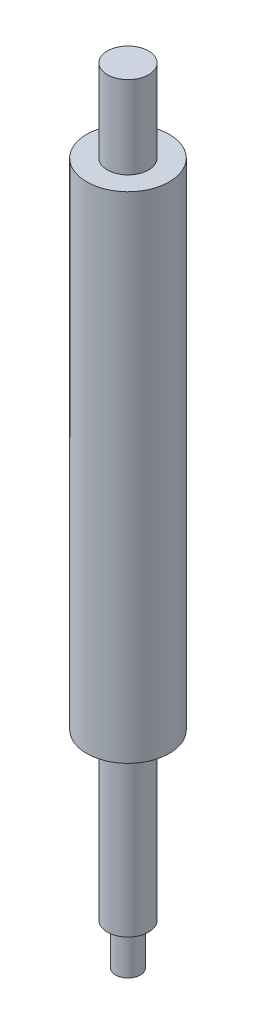
ISO-10303-21;
HEADER;
FILE_DESCRIPTION(('STEP AP214'),'2;1');
FILE_NAME('part.step','',(''),(''),'','','');
FILE_SCHEMA(('AUTOMOTIVE_DESIGN { 1 0 10303 214 1 1 1 1 }'));
ENDSEC;
DATA;
#1=APPLICATION_CONTEXT('core data for automotive mechanical design processes');
#2=APPLICATION_PROTOCOL_DEFINITION('international standard','automotive_design',2000,#1);
#3=PRODUCT_CONTEXT('',#1,'mechanical');
#4=PRODUCT('Part','Part','',(#3));
#5=PRODUCT_RELATED_PRODUCT_CATEGORY('part','',(#4));
#6=PRODUCT_DEFINITION_FORMATION('','',#4);
#7=PRODUCT_DEFINITION_CONTEXT('part definition',#1,'design');
#8=PRODUCT_DEFINITION('design','',#6,#7);
#9=PRODUCT_DEFINITION_SHAPE('','',#8);
#10=(LENGTH_UNIT() NAMED_UNIT(*) SI_UNIT(.MILLI.,.METRE.));
#11=(NAMED_UNIT(*) PLANE_ANGLE_UNIT() SI_UNIT($,.RADIAN.));
#12=(NAMED_UNIT(*) SI_UNIT($,.STERADIAN.) SOLID_ANGLE_UNIT());
#13=UNCERTAINTY_MEASURE_WITH_UNIT(LENGTH_MEASURE(1.E-05),#10,'distance_accuracy_value','');
#14=(GEOMETRIC_REPRESENTATION_CONTEXT(3) GLOBAL_UNCERTAINTY_ASSIGNED_CONTEXT((#13)) GLOBAL_UNIT_ASSIGNED_CONTEXT((#10,
#11,#12)) REPRESENTATION_CONTEXT('',''));
#15=CARTESIAN_POINT('',(0.,0.,0.));
#16=DIRECTION('',(0.,0.,1.));
#17=DIRECTION('',(1.,0.,0.));
#18=AXIS2_PLACEMENT_3D('',#15,#16,#17);
#19=CARTESIAN_POINT('',(1.5,0.,0.));
#20=DIRECTION('',(0.,1.,0.));
#21=DIRECTION('',(-1.,0.,0.));
#22=AXIS2_PLACEMENT_3D('',#19,#20,#21);
#23=PLANE('',#22);
#24=CARTESIAN_POINT('',(0.,0.,0.));
#25=DIRECTION('',(0.,1.,0.));
#26=DIRECTION('',(-1.,0.,0.));
#27=AXIS2_PLACEMENT_3D('',#24,#25,#26);
#28=CIRCLE('',#27,1.5);
#29=CARTESIAN_POINT('',(-1.5,0.,0.));
#30=VERTEX_POINT('',#29);
#31=EDGE_CURVE('E10',#30,#30,#28,.T.);
#32=ORIENTED_EDGE('',*,*,#31,.F.);
#33=EDGE_LOOP('',(#32));
#34=FACE_BOUND('',#33,.T.);
#35=ADVANCED_FACE('F30',(#34),#23,.F.);
#36=CARTESIAN_POINT('',(0.,95.,0.));
#37=DIRECTION('',(0.,1.,0.));
#38=DIRECTION('',(-1.,0.,0.));
#39=AXIS2_PLACEMENT_3D('',#36,#37,#38);
#40=CYLINDRICAL_SURFACE('',#39,1.5);
#41=CARTESIAN_POINT('',(0.,5.,0.));
#42=DIRECTION('',(0.,1.,0.));
#43=DIRECTION('',(-1.,0.,0.));
#44=AXIS2_PLACEMENT_3D('',#41,#42,#43);
#45=CIRCLE('',#44,1.5);
#46=CARTESIAN_POINT('',(-1.5,5.,0.));
#47=VERTEX_POINT('',#46);
#48=EDGE_CURVE('E36',#47,#47,#45,.T.);
#49=ORIENTED_EDGE('',*,*,#48,.F.);
#50=EDGE_LOOP('',(#49));
#51=FACE_BOUND('',#50,.T.);
#52=ORIENTED_EDGE('',*,*,#31,.T.);
#53=EDGE_LOOP('',(#52));
#54=FACE_BOUND('',#53,.T.);
#55=ADVANCED_FACE('F96',(#51,#54),#40,.T.);
#56=CARTESIAN_POINT('',(2.50000000000001,5.,0.));
#57=DIRECTION('',(0.,1.,0.));
#58=DIRECTION('',(-1.,0.,0.));
#59=AXIS2_PLACEMENT_3D('',#56,#57,#58);
#60=PLANE('',#59);
#61=CARTESIAN_POINT('',(0.,5.,0.));
#62=DIRECTION('',(0.,1.,0.));
#63=DIRECTION('',(-1.,0.,0.));
#64=AXIS2_PLACEMENT_3D('',#61,#62,#63);
#65=CIRCLE('',#64,2.50000000000001);
#66=CARTESIAN_POINT('',(-2.50000000000001,5.,0.));
#67=VERTEX_POINT('',#66);
#68=EDGE_CURVE('E40',#67,#67,#65,.T.);
#69=ORIENTED_EDGE('',*,*,#68,.F.);
#70=EDGE_LOOP('',(#69));
#71=FACE_BOUND('',#70,.T.);
#72=ORIENTED_EDGE('',*,*,#48,.T.);
#73=EDGE_LOOP('',(#72));
#74=FACE_BOUND('',#73,.T.);
#75=ADVANCED_FACE('F91',(#71,#74),#60,.F.);
#76=CARTESIAN_POINT('',(0.,95.,0.));
#77=DIRECTION('',(0.,1.,0.));
#78=DIRECTION('',(-1.,0.,0.));
#79=AXIS2_PLACEMENT_3D('',#76,#77,#78);
#80=CYLINDRICAL_SURFACE('',#79,2.50000000000001);
#81=CARTESIAN_POINT('',(0.,25.,0.));
#82=DIRECTION('',(0.,1.,0.));
#83=DIRECTION('',(-1.,0.,0.));
#84=AXIS2_PLACEMENT_3D('',#81,#82,#83);
#85=CIRCLE('',#84,2.50000000000001);
#86=CARTESIAN_POINT('',(-2.50000000000001,25.,0.));
#87=VERTEX_POINT('',#86);
#88=EDGE_CURVE('E44',#87,#87,#85,.T.);
#89=ORIENTED_EDGE('',*,*,#88,.F.);
#90=EDGE_LOOP('',(#89));
#91=FACE_BOUND('',#90,.T.);
#92=ORIENTED_EDGE('',*,*,#68,.T.);
#93=EDGE_LOOP('',(#92));
#94=FACE_BOUND('',#93,.T.);
#95=ADVANCED_FACE('F85',(#91,#94),#80,.T.);
#96=CARTESIAN_POINT('',(2.50000000000001,25.,0.));
#97=DIRECTION('',(0.,1.,0.));
#98=DIRECTION('',(-1.,0.,0.));
#99=AXIS2_PLACEMENT_3D('',#96,#97,#98);
#100=PLANE('',#99);
#101=CARTESIAN_POINT('',(0.,25.,0.));
#102=DIRECTION('',(0.,1.,0.));
#103=DIRECTION('',(-1.,0.,0.));
#104=AXIS2_PLACEMENT_3D('',#101,#102,#103);
#105=CIRCLE('',#104,5.00000000000001);
#106=CARTESIAN_POINT('',(-5.00000000000001,25.,0.));
#107=VERTEX_POINT('',#106);
#108=EDGE_CURVE('E49',#107,#107,#105,.T.);
#109=ORIENTED_EDGE('',*,*,#108,.F.);
#110=EDGE_LOOP('',(#109));
#111=FACE_BOUND('',#110,.T.);
#112=ORIENTED_EDGE('',*,*,#88,.T.);
#113=EDGE_LOOP('',(#112));
#114=FACE_BOUND('',#113,.T.);
#115=ADVANCED_FACE('F79',(#111,#114),#100,.F.);
#116=CARTESIAN_POINT('',(0.,95.,0.));
#117=DIRECTION('',(0.,1.,0.));
#118=DIRECTION('',(-1.,0.,0.));
#119=AXIS2_PLACEMENT_3D('',#116,#117,#118);
#120=CYLINDRICAL_SURFACE('',#119,5.00000000000001);
#121=CARTESIAN_POINT('',(0.,85.,0.));
#122=DIRECTION('',(0.,1.,0.));
#123=DIRECTION('',(-1.,0.,0.));
#124=AXIS2_PLACEMENT_3D('',#121,#122,#123);
#125=CIRCLE('',#124,5.00000000000001);
#126=CARTESIAN_POINT('',(-5.00000000000001,85.,0.));
#127=VERTEX_POINT('',#126);
#128=EDGE_CURVE('E52',#127,#127,#125,.T.);
#129=ORIENTED_EDGE('',*,*,#128,.F.);
#130=EDGE_LOOP('',(#129));
#131=FACE_BOUND('',#130,.T.);
#132=ORIENTED_EDGE('',*,*,#108,.T.);
#133=EDGE_LOOP('',(#132));
#134=FACE_BOUND('',#133,.T.);
#135=ADVANCED_FACE('F73',(#131,#134),#120,.T.);
#136=CARTESIAN_POINT('',(5.00000000000001,85.,0.));
#137=DIRECTION('',(0.,-1.,0.));
#138=DIRECTION('',(1.,0.,0.));
#139=AXIS2_PLACEMENT_3D('',#136,#137,#138);
#140=PLANE('',#139);
#141=CARTESIAN_POINT('',(0.,85.,0.));
#142=DIRECTION('',(0.,1.,0.));
#143=DIRECTION('',(-1.,0.,0.));
#144=AXIS2_PLACEMENT_3D('',#141,#142,#143);
#145=CIRCLE('',#144,2.50000000000001);
#146=CARTESIAN_POINT('',(-2.50000000000002,85.,0.));
#147=VERTEX_POINT('',#146);
#148=EDGE_CURVE('E55',#147,#147,#145,.T.);
#149=ORIENTED_EDGE('',*,*,#148,.F.);
#150=EDGE_LOOP('',(#149));
#151=FACE_BOUND('',#150,.T.);
#152=ORIENTED_EDGE('',*,*,#128,.T.);
#153=EDGE_LOOP('',(#152));
#154=FACE_BOUND('',#153,.T.);
#155=ADVANCED_FACE('F67',(#151,#154),#140,.F.);
#156=CARTESIAN_POINT('',(0.,95.,0.));
#157=DIRECTION('',(0.,1.,0.));
#158=DIRECTION('',(-1.,0.,0.));
#159=AXIS2_PLACEMENT_3D('',#156,#157,#158);
#160=CYLINDRICAL_SURFACE('',#159,2.50000000000001);
#161=CARTESIAN_POINT('',(0.,95.,0.));
#162=DIRECTION('',(0.,1.,0.));
#163=DIRECTION('',(-1.,0.,0.));
#164=AXIS2_PLACEMENT_3D('',#161,#162,#163);
#165=CIRCLE('',#164,2.50000000000001);
#166=CARTESIAN_POINT('',(-2.50000000000001,95.,0.));
#167=VERTEX_POINT('',#166);
#168=EDGE_CURVE('E58',#167,#167,#165,.T.);
#169=ORIENTED_EDGE('',*,*,#168,.F.);
#170=EDGE_LOOP('',(#169));
#171=FACE_BOUND('',#170,.T.);
#172=ORIENTED_EDGE('',*,*,#148,.T.);
#173=EDGE_LOOP('',(#172));
#174=FACE_BOUND('',#173,.T.);
#175=ADVANCED_FACE('F64',(#171,#174),#160,.T.);
#176=CARTESIAN_POINT('',(2.50000000000001,95.,0.));
#177=DIRECTION('',(0.,-1.,0.));
#178=DIRECTION('',(1.,0.,0.));
#179=AXIS2_PLACEMENT_3D('',#176,#177,#178);
#180=PLANE('',#179);
#181=ORIENTED_EDGE('',*,*,#168,.T.);
#182=EDGE_LOOP('',(#181));
#183=FACE_BOUND('',#182,.T.);
#184=ADVANCED_FACE('F62',(#183),#180,.F.);
#185=CLOSED_SHELL('',(#35,#55,#75,#95,#115,#135,#155,#175,#184));
#186=MANIFOLD_SOLID_BREP('B2',#185);
#187=ADVANCED_BREP_SHAPE_REPRESENTATION('',(#18,#186),#14);
#188=SHAPE_DEFINITION_REPRESENTATION(#9,#187);
ENDSEC;
END-ISO-10303-21;
